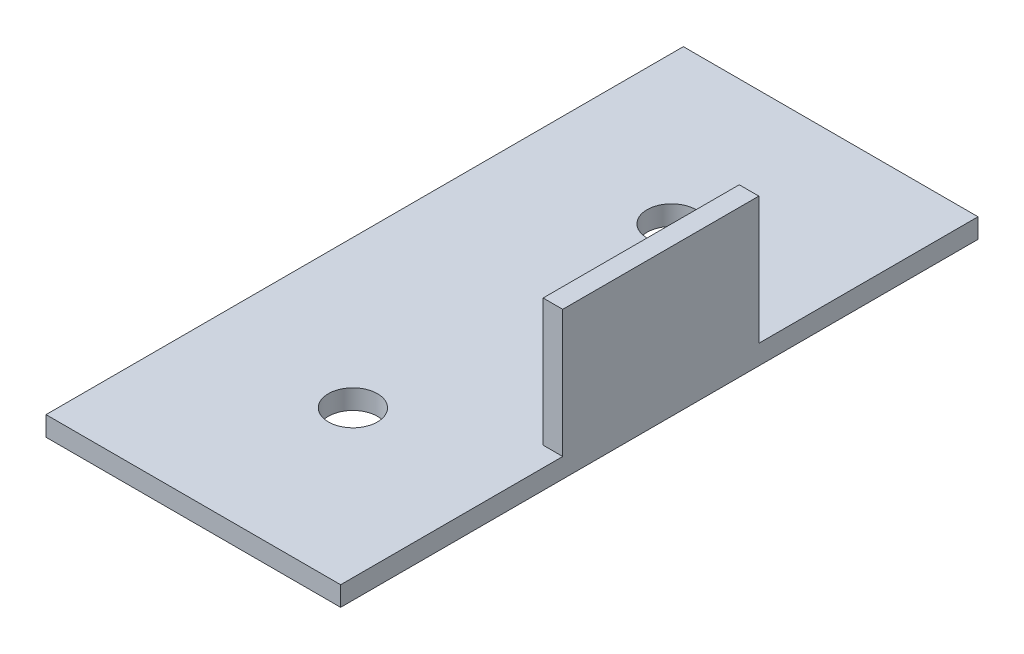
ISO-10303-21;
HEADER;
FILE_DESCRIPTION(('STEP AP214'),'2;1');
FILE_NAME('part.step','',(''),(''),'','','');
FILE_SCHEMA(('AUTOMOTIVE_DESIGN { 1 0 10303 214 1 1 1 1 }'));
ENDSEC;
DATA;
#1=APPLICATION_CONTEXT('core data for automotive mechanical design processes');
#2=APPLICATION_PROTOCOL_DEFINITION('international standard','automotive_design',2000,#1);
#3=PRODUCT_CONTEXT('',#1,'mechanical');
#4=PRODUCT('Part','Part','',(#3));
#5=PRODUCT_RELATED_PRODUCT_CATEGORY('part','',(#4));
#6=PRODUCT_DEFINITION_FORMATION('','',#4);
#7=PRODUCT_DEFINITION_CONTEXT('part definition',#1,'design');
#8=PRODUCT_DEFINITION('design','',#6,#7);
#9=PRODUCT_DEFINITION_SHAPE('','',#8);
#10=(LENGTH_UNIT() NAMED_UNIT(*) SI_UNIT(.MILLI.,.METRE.));
#11=(NAMED_UNIT(*) PLANE_ANGLE_UNIT() SI_UNIT($,.RADIAN.));
#12=(NAMED_UNIT(*) SI_UNIT($,.STERADIAN.) SOLID_ANGLE_UNIT());
#13=UNCERTAINTY_MEASURE_WITH_UNIT(LENGTH_MEASURE(1.E-05),#10,'distance_accuracy_value','');
#14=(GEOMETRIC_REPRESENTATION_CONTEXT(3) GLOBAL_UNCERTAINTY_ASSIGNED_CONTEXT((#13)) GLOBAL_UNIT_ASSIGNED_CONTEXT((#10,
#11,#12)) REPRESENTATION_CONTEXT('',''));
#15=CARTESIAN_POINT('',(0.,0.,0.));
#16=DIRECTION('',(0.,0.,1.));
#17=DIRECTION('',(1.,0.,0.));
#18=AXIS2_PLACEMENT_3D('',#15,#16,#17);
#19=CARTESIAN_POINT('',(2.,30.,20.));
#20=DIRECTION('',(0.,0.,-1.));
#21=DIRECTION('',(-1.,0.,0.));
#22=AXIS2_PLACEMENT_3D('',#19,#20,#21);
#23=PLANE('',#22);
#24=DIRECTION('',(-1.,0.,0.));
#25=VECTOR('',#24,1.);
#26=CARTESIAN_POINT('',(-28.0485514391513,0.,20.));
#27=LINE('',#26,#25);
#28=CARTESIAN_POINT('',(1.99999999812231,0.,20.));
#29=VERTEX_POINT('',#28);
#30=CARTESIAN_POINT('',(0.,0.,20.));
#31=VERTEX_POINT('',#30);
#32=EDGE_CURVE('E57',#29,#31,#27,.T.);
#33=ORIENTED_EDGE('',*,*,#32,.F.);
#34=DIRECTION('',(0.,1.,0.));
#35=VECTOR('',#34,1.);
#36=CARTESIAN_POINT('',(2.,0.,20.));
#37=LINE('',#36,#35);
#38=CARTESIAN_POINT('',(2.,13.000000037385,20.));
#39=VERTEX_POINT('',#38);
#40=EDGE_CURVE('E159',#29,#39,#37,.T.);
#41=ORIENTED_EDGE('',*,*,#40,.T.);
#42=DIRECTION('',(1.,0.,0.));
#43=VECTOR('',#42,1.);
#44=CARTESIAN_POINT('',(-28.0485514391513,13.000000037385,20.));
#45=LINE('',#44,#43);
#46=CARTESIAN_POINT('',(0.,13.000000037385,20.));
#47=VERTEX_POINT('',#46);
#48=EDGE_CURVE('E186',#47,#39,#45,.T.);
#49=ORIENTED_EDGE('',*,*,#48,.F.);
#50=DIRECTION('',(0.,1.,0.));
#51=VECTOR('',#50,1.);
#52=CARTESIAN_POINT('',(0.,0.,20.));
#53=LINE('',#52,#51);
#54=EDGE_CURVE('E164',#31,#47,#53,.T.);
#55=ORIENTED_EDGE('',*,*,#54,.F.);
#56=EDGE_LOOP('',(#33,#41,#49,#55));
#57=FACE_BOUND('',#56,.T.);
#58=ADVANCED_FACE('F31',(#57),#23,.F.);
#59=CARTESIAN_POINT('',(2.,0.,20.));
#60=DIRECTION('',(-1.,0.,0.));
#61=DIRECTION('',(0.,0.,1.));
#62=AXIS2_PLACEMENT_3D('',#59,#60,#61);
#63=PLANE('',#62);
#64=DIRECTION('',(0.,0.,-1.));
#65=VECTOR('',#64,1.);
#66=CARTESIAN_POINT('',(2.,-2.,20.));
#67=LINE('',#66,#65);
#68=CARTESIAN_POINT('',(1.99999999812231,-2.,42.650000030543));
#69=VERTEX_POINT('',#68);
#70=CARTESIAN_POINT('',(2.00000000184951,-2.,-22.349999969457));
#71=VERTEX_POINT('',#70);
#72=EDGE_CURVE('E112',#69,#71,#67,.T.);
#73=ORIENTED_EDGE('',*,*,#72,.T.);
#74=DIRECTION('',(0.,1.,0.));
#75=VECTOR('',#74,1.);
#76=CARTESIAN_POINT('',(2.00000000184951,-2.,-22.349999969457));
#77=LINE('',#76,#75);
#78=CARTESIAN_POINT('',(2.00000000184951,0.,-22.349999969457));
#79=VERTEX_POINT('',#78);
#80=EDGE_CURVE('E138',#71,#79,#77,.T.);
#81=ORIENTED_EDGE('',*,*,#80,.T.);
#82=DIRECTION('',(1.66765274294909E-10,0.,-1.));
#83=VECTOR('',#82,1.);
#84=CARTESIAN_POINT('',(1.99999999812231,0.,0.));
#85=LINE('',#84,#83);
#86=CARTESIAN_POINT('',(1.99999999812231,0.,0.));
#87=VERTEX_POINT('',#86);
#88=EDGE_CURVE('E147',#87,#79,#85,.T.);
#89=ORIENTED_EDGE('',*,*,#88,.F.);
#90=DIRECTION('',(0.,1.,0.));
#91=VECTOR('',#90,1.);
#92=CARTESIAN_POINT('',(2.,0.,0.));
#93=LINE('',#92,#91);
#94=CARTESIAN_POINT('',(2.,13.000000037385,0.));
#95=VERTEX_POINT('',#94);
#96=EDGE_CURVE('E48',#87,#95,#93,.T.);
#97=ORIENTED_EDGE('',*,*,#96,.T.);
#98=DIRECTION('',(0.,0.,-1.));
#99=VECTOR('',#98,1.);
#100=CARTESIAN_POINT('',(2.,13.000000037385,0.));
#101=LINE('',#100,#99);
#102=EDGE_CURVE('E179',#39,#95,#101,.T.);
#103=ORIENTED_EDGE('',*,*,#102,.F.);
#104=ORIENTED_EDGE('',*,*,#40,.F.);
#105=DIRECTION('',(0.,0.,-1.));
#106=VECTOR('',#105,1.);
#107=CARTESIAN_POINT('',(1.99999999812231,0.,20.));
#108=LINE('',#107,#106);
#109=CARTESIAN_POINT('',(1.99999999812231,0.,42.650000030543));
#110=VERTEX_POINT('',#109);
#111=EDGE_CURVE('E125',#110,#29,#108,.T.);
#112=ORIENTED_EDGE('',*,*,#111,.F.);
#113=DIRECTION('',(0.,1.,0.));
#114=VECTOR('',#113,1.);
#115=CARTESIAN_POINT('',(1.99999999812231,-2.,42.650000030543));
#116=LINE('',#115,#114);
#117=EDGE_CURVE('E120',#69,#110,#116,.T.);
#118=ORIENTED_EDGE('',*,*,#117,.F.);
#119=EDGE_LOOP('',(#73,#81,#89,#97,#103,#104,#112,#118));
#120=FACE_BOUND('',#119,.T.);
#121=ADVANCED_FACE('F33',(#120),#63,.F.);
#122=CARTESIAN_POINT('',(0.,0.,20.));
#123=DIRECTION('',(-1.,0.,0.));
#124=DIRECTION('',(0.,0.,1.));
#125=AXIS2_PLACEMENT_3D('',#122,#123,#124);
#126=PLANE('',#125);
#127=DIRECTION('',(0.,0.,1.));
#128=VECTOR('',#127,1.);
#129=CARTESIAN_POINT('',(0.,13.000000037385,20.));
#130=LINE('',#129,#128);
#131=CARTESIAN_POINT('',(0.,13.000000037385,0.));
#132=VERTEX_POINT('',#131);
#133=EDGE_CURVE('E168',#132,#47,#130,.T.);
#134=ORIENTED_EDGE('',*,*,#133,.F.);
#135=DIRECTION('',(0.,1.,0.));
#136=VECTOR('',#135,1.);
#137=CARTESIAN_POINT('',(0.,0.,0.));
#138=LINE('',#137,#136);
#139=CARTESIAN_POINT('',(0.,0.,0.));
#140=VERTEX_POINT('',#139);
#141=EDGE_CURVE('E156',#140,#132,#138,.T.);
#142=ORIENTED_EDGE('',*,*,#141,.F.);
#143=DIRECTION('',(0.,0.,-1.));
#144=VECTOR('',#143,1.);
#145=CARTESIAN_POINT('',(0.,0.,20.));
#146=LINE('',#145,#144);
#147=EDGE_CURVE('E152',#31,#140,#146,.T.);
#148=ORIENTED_EDGE('',*,*,#147,.F.);
#149=ORIENTED_EDGE('',*,*,#54,.T.);
#150=EDGE_LOOP('',(#134,#142,#148,#149));
#151=FACE_BOUND('',#150,.T.);
#152=ADVANCED_FACE('F184',(#151),#126,.T.);
#153=CARTESIAN_POINT('',(0.,0.,20.));
#154=DIRECTION('',(0.,1.,0.));
#155=DIRECTION('',(0.,0.,1.));
#156=AXIS2_PLACEMENT_3D('',#153,#154,#155);
#157=PLANE('',#156);
#158=CARTESIAN_POINT('',(-13.0000000009459,0.,26.4000000297212));
#159=DIRECTION('',(0.,1.,0.));
#160=DIRECTION('',(0.,0.,1.));
#161=AXIS2_PLACEMENT_3D('',#158,#159,#160);
#162=CIRCLE('',#161,2.49999999999892);
#163=CARTESIAN_POINT('',(-13.0000000009459,0.,28.9000000297201));
#164=VERTEX_POINT('',#163);
#165=EDGE_CURVE('E225',#164,#164,#162,.T.);
#166=ORIENTED_EDGE('',*,*,#165,.F.);
#167=EDGE_LOOP('',(#166));
#168=FACE_BOUND('',#167,.T.);
#169=CARTESIAN_POINT('',(-12.9999999990823,0.,-6.09999997027878));
#170=DIRECTION('',(0.,1.,0.));
#171=DIRECTION('',(0.,0.,1.));
#172=AXIS2_PLACEMENT_3D('',#169,#170,#171);
#173=CIRCLE('',#172,2.5);
#174=CARTESIAN_POINT('',(-12.9999999990823,0.,-3.59999997027878));
#175=VERTEX_POINT('',#174);
#176=EDGE_CURVE('E129',#175,#175,#173,.T.);
#177=ORIENTED_EDGE('',*,*,#176,.F.);
#178=EDGE_LOOP('',(#177));
#179=FACE_BOUND('',#178,.T.);
#180=ORIENTED_EDGE('',*,*,#147,.T.);
#181=DIRECTION('',(1.,0.,0.));
#182=VECTOR('',#181,1.);
#183=CARTESIAN_POINT('',(-28.0485514391513,0.,0.));
#184=LINE('',#183,#182);
#185=EDGE_CURVE('E11',#140,#87,#184,.T.);
#186=ORIENTED_EDGE('',*,*,#185,.T.);
#187=ORIENTED_EDGE('',*,*,#88,.T.);
#188=DIRECTION('',(-1.,0.,0.));
#189=VECTOR('',#188,1.);
#190=CARTESIAN_POINT('',(-28.0485514391513,0.,-22.349999969457));
#191=LINE('',#190,#189);
#192=CARTESIAN_POINT('',(-28.0485514391513,0.,-22.349999969457));
#193=VERTEX_POINT('',#192);
#194=EDGE_CURVE('E139',#79,#193,#191,.T.);
#195=ORIENTED_EDGE('',*,*,#194,.T.);
#196=DIRECTION('',(0.,0.,-1.));
#197=VECTOR('',#196,1.);
#198=CARTESIAN_POINT('',(-28.0485514391513,0.,20.));
#199=LINE('',#198,#197);
#200=CARTESIAN_POINT('',(-28.0485514391513,0.,42.650000030543));
#201=VERTEX_POINT('',#200);
#202=EDGE_CURVE('E111',#201,#193,#199,.T.);
#203=ORIENTED_EDGE('',*,*,#202,.F.);
#204=DIRECTION('',(1.,0.,0.));
#205=VECTOR('',#204,1.);
#206=CARTESIAN_POINT('',(-28.0485514391513,0.,42.650000030543));
#207=LINE('',#206,#205);
#208=EDGE_CURVE('E119',#201,#110,#207,.T.);
#209=ORIENTED_EDGE('',*,*,#208,.T.);
#210=ORIENTED_EDGE('',*,*,#111,.T.);
#211=ORIENTED_EDGE('',*,*,#32,.T.);
#212=EDGE_LOOP('',(#180,#186,#187,#195,#203,#209,#210,#211));
#213=FACE_BOUND('',#212,.T.);
#214=ADVANCED_FACE('F188',(#168,#179,#213),#157,.T.);
#215=CARTESIAN_POINT('',(-28.0485514391513,-2.,20.));
#216=DIRECTION('',(-1.,0.,0.));
#217=DIRECTION('',(0.,0.,1.));
#218=AXIS2_PLACEMENT_3D('',#215,#216,#217);
#219=PLANE('',#218);
#220=ORIENTED_EDGE('',*,*,#202,.T.);
#221=DIRECTION('',(0.,1.,0.));
#222=VECTOR('',#221,1.);
#223=CARTESIAN_POINT('',(-28.0485514391513,-2.,-22.349999969457));
#224=LINE('',#223,#222);
#225=CARTESIAN_POINT('',(-28.0485514391513,-2.,-22.349999969457));
#226=VERTEX_POINT('',#225);
#227=EDGE_CURVE('E106',#226,#193,#224,.T.);
#228=ORIENTED_EDGE('',*,*,#227,.F.);
#229=DIRECTION('',(0.,0.,-1.));
#230=VECTOR('',#229,1.);
#231=CARTESIAN_POINT('',(-28.0485514391513,-2.,20.));
#232=LINE('',#231,#230);
#233=CARTESIAN_POINT('',(-28.0485514391513,-2.,42.650000030543));
#234=VERTEX_POINT('',#233);
#235=EDGE_CURVE('E100',#234,#226,#232,.T.);
#236=ORIENTED_EDGE('',*,*,#235,.F.);
#237=DIRECTION('',(0.,1.,0.));
#238=VECTOR('',#237,1.);
#239=CARTESIAN_POINT('',(-28.0485514391513,-2.,42.650000030543));
#240=LINE('',#239,#238);
#241=EDGE_CURVE('E103',#234,#201,#240,.T.);
#242=ORIENTED_EDGE('',*,*,#241,.T.);
#243=EDGE_LOOP('',(#220,#228,#236,#242));
#244=FACE_BOUND('',#243,.T.);
#245=ADVANCED_FACE('F102',(#244),#219,.T.);
#246=CARTESIAN_POINT('',(0.,-2.,20.));
#247=DIRECTION('',(0.,1.,0.));
#248=DIRECTION('',(0.,0.,1.));
#249=AXIS2_PLACEMENT_3D('',#246,#247,#248);
#250=PLANE('',#249);
#251=CARTESIAN_POINT('',(-13.0000000009459,-2.,26.4000000297212));
#252=DIRECTION('',(0.,1.,0.));
#253=DIRECTION('',(0.,0.,1.));
#254=AXIS2_PLACEMENT_3D('',#251,#252,#253);
#255=CIRCLE('',#254,2.49999999999892);
#256=CARTESIAN_POINT('',(-13.0000000009459,-2.,28.9000000297201));
#257=VERTEX_POINT('',#256);
#258=EDGE_CURVE('E229',#257,#257,#255,.T.);
#259=ORIENTED_EDGE('',*,*,#258,.T.);
#260=EDGE_LOOP('',(#259));
#261=FACE_BOUND('',#260,.T.);
#262=CARTESIAN_POINT('',(-12.9999999990823,-2.,-6.09999997027878));
#263=DIRECTION('',(0.,1.,0.));
#264=DIRECTION('',(0.,0.,1.));
#265=AXIS2_PLACEMENT_3D('',#262,#263,#264);
#266=CIRCLE('',#265,2.5);
#267=CARTESIAN_POINT('',(-12.9999999990823,-2.,-3.59999997027878));
#268=VERTEX_POINT('',#267);
#269=EDGE_CURVE('E132',#268,#268,#266,.T.);
#270=ORIENTED_EDGE('',*,*,#269,.T.);
#271=EDGE_LOOP('',(#270));
#272=FACE_BOUND('',#271,.T.);
#273=ORIENTED_EDGE('',*,*,#235,.T.);
#274=DIRECTION('',(-1.,0.,0.));
#275=VECTOR('',#274,1.);
#276=CARTESIAN_POINT('',(-28.0485514391513,-2.,-22.349999969457));
#277=LINE('',#276,#275);
#278=EDGE_CURVE('E136',#71,#226,#277,.T.);
#279=ORIENTED_EDGE('',*,*,#278,.F.);
#280=ORIENTED_EDGE('',*,*,#72,.F.);
#281=DIRECTION('',(1.,0.,0.));
#282=VECTOR('',#281,1.);
#283=CARTESIAN_POINT('',(-28.0485514391513,-2.,42.650000030543));
#284=LINE('',#283,#282);
#285=EDGE_CURVE('E117',#234,#69,#284,.T.);
#286=ORIENTED_EDGE('',*,*,#285,.F.);
#287=EDGE_LOOP('',(#273,#279,#280,#286));
#288=FACE_BOUND('',#287,.T.);
#289=ADVANCED_FACE('F122',(#261,#272,#288),#250,.F.);
#290=CARTESIAN_POINT('',(2.,30.,0.));
#291=DIRECTION('',(0.,0.,-1.));
#292=DIRECTION('',(-1.,0.,0.));
#293=AXIS2_PLACEMENT_3D('',#290,#291,#292);
#294=PLANE('',#293);
#295=ORIENTED_EDGE('',*,*,#185,.F.);
#296=ORIENTED_EDGE('',*,*,#141,.T.);
#297=DIRECTION('',(-1.,0.,0.));
#298=VECTOR('',#297,1.);
#299=CARTESIAN_POINT('',(2.,13.000000037385,0.));
#300=LINE('',#299,#298);
#301=EDGE_CURVE('E40',#95,#132,#300,.T.);
#302=ORIENTED_EDGE('',*,*,#301,.F.);
#303=ORIENTED_EDGE('',*,*,#96,.F.);
#304=EDGE_LOOP('',(#295,#296,#302,#303));
#305=FACE_BOUND('',#304,.T.);
#306=ADVANCED_FACE('F187',(#305),#294,.T.);
#307=CARTESIAN_POINT('',(-28.0485514391513,13.000000037385,0.));
#308=DIRECTION('',(0.,-1.,0.));
#309=DIRECTION('',(0.,0.,-1.));
#310=AXIS2_PLACEMENT_3D('',#307,#308,#309);
#311=PLANE('',#310);
#312=ORIENTED_EDGE('',*,*,#133,.T.);
#313=ORIENTED_EDGE('',*,*,#48,.T.);
#314=ORIENTED_EDGE('',*,*,#102,.T.);
#315=ORIENTED_EDGE('',*,*,#301,.T.);
#316=EDGE_LOOP('',(#312,#313,#314,#315));
#317=FACE_BOUND('',#316,.T.);
#318=ADVANCED_FACE('F176',(#317),#311,.F.);
#319=CARTESIAN_POINT('',(-28.0485514391513,-2.,-22.349999969457));
#320=DIRECTION('',(0.,0.,-1.));
#321=DIRECTION('',(-1.,0.,0.));
#322=AXIS2_PLACEMENT_3D('',#319,#320,#321);
#323=PLANE('',#322);
#324=ORIENTED_EDGE('',*,*,#194,.F.);
#325=ORIENTED_EDGE('',*,*,#80,.F.);
#326=ORIENTED_EDGE('',*,*,#278,.T.);
#327=ORIENTED_EDGE('',*,*,#227,.T.);
#328=EDGE_LOOP('',(#324,#325,#326,#327));
#329=FACE_BOUND('',#328,.T.);
#330=ADVANCED_FACE('F196',(#329),#323,.T.);
#331=CARTESIAN_POINT('',(-28.0485514391513,-2.,42.650000030543));
#332=DIRECTION('',(0.,0.,1.));
#333=DIRECTION('',(1.,0.,0.));
#334=AXIS2_PLACEMENT_3D('',#331,#332,#333);
#335=PLANE('',#334);
#336=ORIENTED_EDGE('',*,*,#208,.F.);
#337=ORIENTED_EDGE('',*,*,#241,.F.);
#338=ORIENTED_EDGE('',*,*,#285,.T.);
#339=ORIENTED_EDGE('',*,*,#117,.T.);
#340=EDGE_LOOP('',(#336,#337,#338,#339));
#341=FACE_BOUND('',#340,.T.);
#342=ADVANCED_FACE('F116',(#341),#335,.T.);
#343=CARTESIAN_POINT('',(-12.9999999990823,-2.,-6.09999997027878));
#344=DIRECTION('',(0.,1.,0.));
#345=DIRECTION('',(0.,0.,1.));
#346=AXIS2_PLACEMENT_3D('',#343,#344,#345);
#347=CYLINDRICAL_SURFACE('',#346,2.5);
#348=ORIENTED_EDGE('',*,*,#269,.F.);
#349=EDGE_LOOP('',(#348));
#350=FACE_BOUND('',#349,.T.);
#351=ORIENTED_EDGE('',*,*,#176,.T.);
#352=EDGE_LOOP('',(#351));
#353=FACE_BOUND('',#352,.T.);
#354=ADVANCED_FACE('F238',(#350,#353),#347,.F.);
#355=CARTESIAN_POINT('',(-13.0000000009459,-2.,26.4000000297212));
#356=DIRECTION('',(0.,1.,0.));
#357=DIRECTION('',(0.,0.,1.));
#358=AXIS2_PLACEMENT_3D('',#355,#356,#357);
#359=CYLINDRICAL_SURFACE('',#358,2.49999999999892);
#360=ORIENTED_EDGE('',*,*,#258,.F.);
#361=EDGE_LOOP('',(#360));
#362=FACE_BOUND('',#361,.T.);
#363=ORIENTED_EDGE('',*,*,#165,.T.);
#364=EDGE_LOOP('',(#363));
#365=FACE_BOUND('',#364,.T.);
#366=ADVANCED_FACE('F236',(#362,#365),#359,.F.);
#367=CLOSED_SHELL('',(#58,#121,#152,#214,#245,#289,#306,#318,#330,#342,#354,#366));
#368=MANIFOLD_SOLID_BREP('B2',#367);
#369=ADVANCED_BREP_SHAPE_REPRESENTATION('',(#18,#368),#14);
#370=SHAPE_DEFINITION_REPRESENTATION(#9,#369);
ENDSEC;
END-ISO-10303-21;
